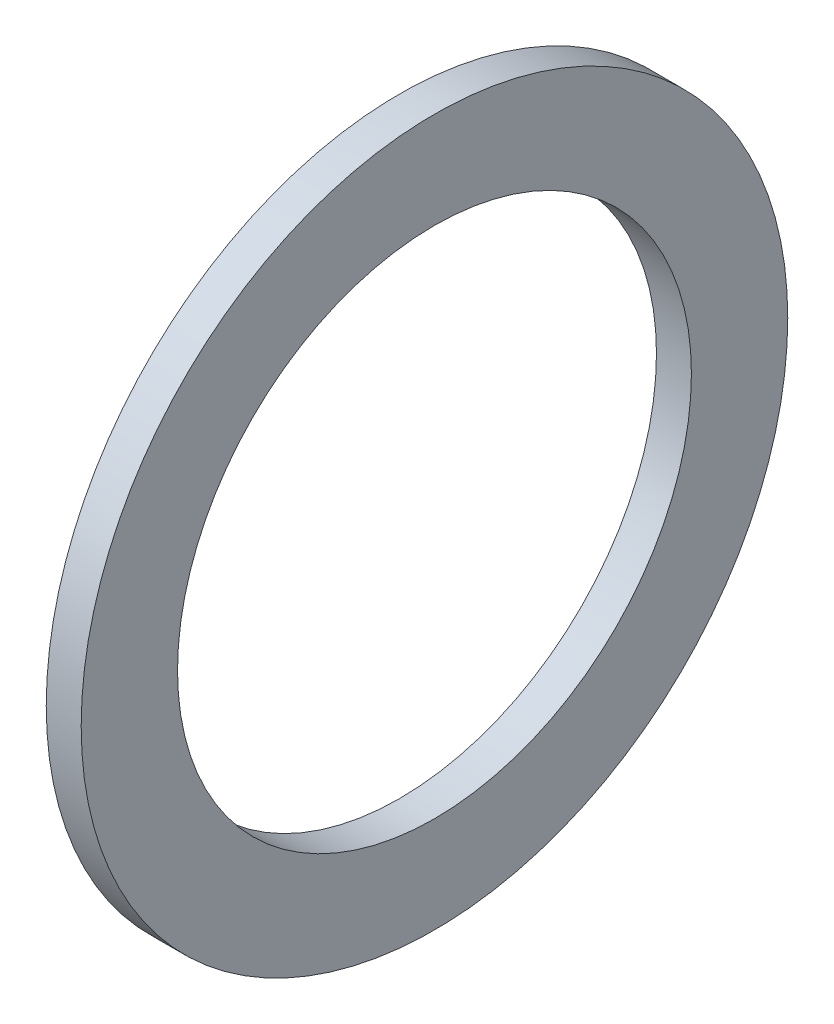
ISO-10303-21;
HEADER;
FILE_DESCRIPTION(('STEP AP214'),'2;1');
FILE_NAME('part.step','',(''),(''),'','','');
FILE_SCHEMA(('AUTOMOTIVE_DESIGN { 1 0 10303 214 1 1 1 1 }'));
ENDSEC;
DATA;
#1=APPLICATION_CONTEXT('core data for automotive mechanical design processes');
#2=APPLICATION_PROTOCOL_DEFINITION('international standard','automotive_design',2000,#1);
#3=PRODUCT_CONTEXT('',#1,'mechanical');
#4=PRODUCT('Part','Part','',(#3));
#5=PRODUCT_RELATED_PRODUCT_CATEGORY('part','',(#4));
#6=PRODUCT_DEFINITION_FORMATION('','',#4);
#7=PRODUCT_DEFINITION_CONTEXT('part definition',#1,'design');
#8=PRODUCT_DEFINITION('design','',#6,#7);
#9=PRODUCT_DEFINITION_SHAPE('','',#8);
#10=(LENGTH_UNIT() NAMED_UNIT(*) SI_UNIT(.MILLI.,.METRE.));
#11=(NAMED_UNIT(*) PLANE_ANGLE_UNIT() SI_UNIT($,.RADIAN.));
#12=(NAMED_UNIT(*) SI_UNIT($,.STERADIAN.) SOLID_ANGLE_UNIT());
#13=UNCERTAINTY_MEASURE_WITH_UNIT(LENGTH_MEASURE(1.E-05),#10,'distance_accuracy_value','');
#14=(GEOMETRIC_REPRESENTATION_CONTEXT(3) GLOBAL_UNCERTAINTY_ASSIGNED_CONTEXT((#13)) GLOBAL_UNIT_ASSIGNED_CONTEXT((#10,
#11,#12)) REPRESENTATION_CONTEXT('',''));
#15=CARTESIAN_POINT('',(0.,0.,0.));
#16=DIRECTION('',(0.,0.,1.));
#17=DIRECTION('',(1.,0.,0.));
#18=AXIS2_PLACEMENT_3D('',#15,#16,#17);
#19=CARTESIAN_POINT('',(0.,0.,0.));
#20=DIRECTION('',(1.,0.,0.));
#21=DIRECTION('',(0.,0.,-1.));
#22=AXIS2_PLACEMENT_3D('',#19,#20,#21);
#23=PLANE('',#22);
#24=CARTESIAN_POINT('',(0.,0.,0.));
#25=DIRECTION('',(-1.,0.,0.));
#26=DIRECTION('',(0.,0.,1.));
#27=AXIS2_PLACEMENT_3D('',#24,#25,#26);
#28=CIRCLE('',#27,6.35);
#29=CARTESIAN_POINT('',(0.,0.,6.35));
#30=VERTEX_POINT('',#29);
#31=EDGE_CURVE('E27',#30,#30,#28,.F.);
#32=ORIENTED_EDGE('',*,*,#31,.T.);
#33=EDGE_LOOP('',(#32));
#34=FACE_BOUND('',#33,.T.);
#35=CARTESIAN_POINT('',(0.,0.,0.));
#36=DIRECTION('',(-1.,0.,0.));
#37=DIRECTION('',(0.,0.,1.));
#38=AXIS2_PLACEMENT_3D('',#35,#36,#37);
#39=CIRCLE('',#38,8.73125);
#40=CARTESIAN_POINT('',(0.,0.,8.73125));
#41=VERTEX_POINT('',#40);
#42=EDGE_CURVE('E18',#41,#41,#39,.F.);
#43=ORIENTED_EDGE('',*,*,#42,.F.);
#44=EDGE_LOOP('',(#43));
#45=FACE_BOUND('',#44,.T.);
#46=ADVANCED_FACE('F15',(#34,#45),#23,.F.);
#47=CARTESIAN_POINT('',(0.8636,0.,0.));
#48=DIRECTION('',(-1.,0.,0.));
#49=DIRECTION('',(0.,0.,1.));
#50=AXIS2_PLACEMENT_3D('',#47,#48,#49);
#51=CYLINDRICAL_SURFACE('',#50,8.73125);
#52=ORIENTED_EDGE('',*,*,#42,.T.);
#53=EDGE_LOOP('',(#52));
#54=FACE_BOUND('',#53,.T.);
#55=CARTESIAN_POINT('',(0.8636,0.,0.));
#56=DIRECTION('',(-1.,0.,0.));
#57=DIRECTION('',(0.,0.,1.));
#58=AXIS2_PLACEMENT_3D('',#55,#56,#57);
#59=CIRCLE('',#58,8.73125);
#60=CARTESIAN_POINT('',(0.8636,0.,8.73125));
#61=VERTEX_POINT('',#60);
#62=EDGE_CURVE('E22',#61,#61,#59,.F.);
#63=ORIENTED_EDGE('',*,*,#62,.F.);
#64=EDGE_LOOP('',(#63));
#65=FACE_BOUND('',#64,.T.);
#66=ADVANCED_FACE('F35',(#54,#65),#51,.T.);
#67=CARTESIAN_POINT('',(0.8636,0.,0.));
#68=DIRECTION('',(-1.,0.,0.));
#69=DIRECTION('',(0.,0.,1.));
#70=AXIS2_PLACEMENT_3D('',#67,#68,#69);
#71=CYLINDRICAL_SURFACE('',#70,6.35);
#72=CARTESIAN_POINT('',(0.8636,0.,0.));
#73=DIRECTION('',(-1.,0.,0.));
#74=DIRECTION('',(0.,0.,1.));
#75=AXIS2_PLACEMENT_3D('',#72,#73,#74);
#76=CIRCLE('',#75,6.35);
#77=CARTESIAN_POINT('',(0.8636,0.,6.35));
#78=VERTEX_POINT('',#77);
#79=EDGE_CURVE('E10',#78,#78,#76,.T.);
#80=ORIENTED_EDGE('',*,*,#79,.F.);
#81=EDGE_LOOP('',(#80));
#82=FACE_BOUND('',#81,.T.);
#83=ORIENTED_EDGE('',*,*,#31,.F.);
#84=EDGE_LOOP('',(#83));
#85=FACE_BOUND('',#84,.T.);
#86=ADVANCED_FACE('F43',(#82,#85),#71,.F.);
#87=CARTESIAN_POINT('',(0.8636,0.,0.));
#88=DIRECTION('',(1.,0.,0.));
#89=DIRECTION('',(0.,0.,-1.));
#90=AXIS2_PLACEMENT_3D('',#87,#88,#89);
#91=PLANE('',#90);
#92=ORIENTED_EDGE('',*,*,#79,.T.);
#93=EDGE_LOOP('',(#92));
#94=FACE_BOUND('',#93,.T.);
#95=ORIENTED_EDGE('',*,*,#62,.T.);
#96=EDGE_LOOP('',(#95));
#97=FACE_BOUND('',#96,.T.);
#98=ADVANCED_FACE('F44',(#94,#97),#91,.T.);
#99=CLOSED_SHELL('',(#46,#66,#86,#98));
#100=MANIFOLD_SOLID_BREP('B1',#99);
#101=ADVANCED_BREP_SHAPE_REPRESENTATION('',(#18,#100),#14);
#102=SHAPE_DEFINITION_REPRESENTATION(#9,#101);
ENDSEC;
END-ISO-10303-21;
